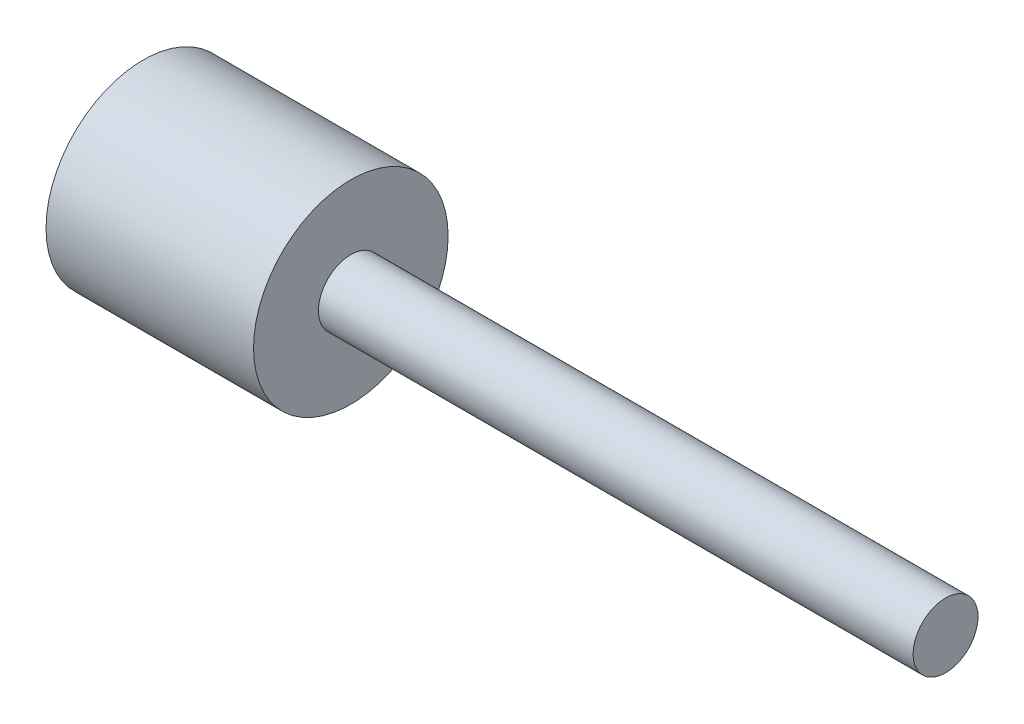
ISO-10303-21;
HEADER;
FILE_DESCRIPTION(('STEP AP214'),'2;1');
FILE_NAME('part.step','',(''),(''),'','','');
FILE_SCHEMA(('AUTOMOTIVE_DESIGN { 1 0 10303 214 1 1 1 1 }'));
ENDSEC;
DATA;
#1=APPLICATION_CONTEXT('core data for automotive mechanical design processes');
#2=APPLICATION_PROTOCOL_DEFINITION('international standard','automotive_design',2000,#1);
#3=PRODUCT_CONTEXT('',#1,'mechanical');
#4=PRODUCT('Part','Part','',(#3));
#5=PRODUCT_RELATED_PRODUCT_CATEGORY('part','',(#4));
#6=PRODUCT_DEFINITION_FORMATION('','',#4);
#7=PRODUCT_DEFINITION_CONTEXT('part definition',#1,'design');
#8=PRODUCT_DEFINITION('design','',#6,#7);
#9=PRODUCT_DEFINITION_SHAPE('','',#8);
#10=(LENGTH_UNIT() NAMED_UNIT(*) SI_UNIT(.MILLI.,.METRE.));
#11=(NAMED_UNIT(*) PLANE_ANGLE_UNIT() SI_UNIT($,.RADIAN.));
#12=(NAMED_UNIT(*) SI_UNIT($,.STERADIAN.) SOLID_ANGLE_UNIT());
#13=UNCERTAINTY_MEASURE_WITH_UNIT(LENGTH_MEASURE(1.E-05),#10,'distance_accuracy_value','');
#14=(GEOMETRIC_REPRESENTATION_CONTEXT(3) GLOBAL_UNCERTAINTY_ASSIGNED_CONTEXT((#13)) GLOBAL_UNIT_ASSIGNED_CONTEXT((#10,
#11,#12)) REPRESENTATION_CONTEXT('',''));
#15=CARTESIAN_POINT('',(0.,0.,0.));
#16=DIRECTION('',(0.,0.,1.));
#17=DIRECTION('',(1.,0.,0.));
#18=AXIS2_PLACEMENT_3D('',#15,#16,#17);
#19=CARTESIAN_POINT('',(16.,0.,0.));
#20=DIRECTION('',(-1.,0.,0.));
#21=DIRECTION('',(0.,0.,1.));
#22=AXIS2_PLACEMENT_3D('',#19,#20,#21);
#23=CYLINDRICAL_SURFACE('',#22,7.5);
#24=CARTESIAN_POINT('',(5.,-7.34846922834953,1.5));
#25=CARTESIAN_POINT('',(4.91665343676424,-7.34847088538349,1.49999691881235));
#26=CARTESIAN_POINT('',(4.83326806500025,-7.34990262402618,1.49302975757707));
#27=CARTESIAN_POINT('',(4.66885624228504,-7.35546646957746,1.46536842537441));
#28=CARTESIAN_POINT('',(4.58783173304596,-7.35960073717297,1.44466327060578));
#29=CARTESIAN_POINT('',(4.43054404496875,-7.37008310582665,1.39019367392958));
#30=CARTESIAN_POINT('',(4.35427621770114,-7.37642900431582,1.35644222122892));
#31=CARTESIAN_POINT('',(4.20848773295455,-7.39061699221019,1.27687366150577));
#32=CARTESIAN_POINT('',(4.13896669919314,-7.398458998102,1.23105722790173));
#33=CARTESIAN_POINT('',(4.00765849421921,-7.4148794954137,1.12796861348015));
#34=CARTESIAN_POINT('',(3.94598061817404,-7.42346606755867,1.07055848386998));
#35=CARTESIAN_POINT('',(3.83306369963153,-7.440337084539,0.946210183531966));
#36=CARTESIAN_POINT('',(3.78182538887421,-7.44862150816248,0.879271345466977));
#37=CARTESIAN_POINT('',(3.69081797355731,-7.46404194626342,0.737042033886384));
#38=CARTESIAN_POINT('',(3.65115272927504,-7.47116732162326,0.661683851508316));
#39=CARTESIAN_POINT('',(3.5850875944278,-7.48337605325447,0.505206225580907));
#40=CARTESIAN_POINT('',(3.55868646214851,-7.48845960066179,0.42408732213083));
#41=CARTESIAN_POINT('',(3.52023920957056,-7.49595481032628,0.259525159917742));
#42=CARTESIAN_POINT('',(3.50800853364349,-7.4984007943219,0.176126608822221));
#43=CARTESIAN_POINT('',(3.49767357224253,-7.50046381775405,0.00842785265630496));
#44=CARTESIAN_POINT('',(3.49956792553127,-7.50008112979138,-0.0758722647477643));
#45=CARTESIAN_POINT('',(3.51728927032333,-7.49655652302773,-0.241713001115383));
#46=CARTESIAN_POINT('',(3.53291746575177,-7.49345397548757,-0.323275821447705));
#47=CARTESIAN_POINT('',(3.57734754868834,-7.48488265739113,-0.482597439870451));
#48=CARTESIAN_POINT('',(3.60614996328781,-7.47941379216059,-0.560356085620693));
#49=CARTESIAN_POINT('',(3.6762950602209,-7.46665944029938,-0.71042919480133));
#50=CARTESIAN_POINT('',(3.71771562665733,-7.45936272262835,-0.78270626120085));
#51=CARTESIAN_POINT('',(3.8118636158549,-7.44375704210678,-0.919357568789634));
#52=CARTESIAN_POINT('',(3.86459233965578,-7.43544796282833,-0.983730899287501));
#53=CARTESIAN_POINT('',(3.98095043316271,-7.41856446546689,-1.10392714658019));
#54=CARTESIAN_POINT('',(4.04475378009439,-7.40998794686274,-1.15958147486045));
#55=CARTESIAN_POINT('',(4.18087466367613,-7.39367357398141,-1.25942773976521));
#56=CARTESIAN_POINT('',(4.25319236132479,-7.38593573556822,-1.30361945959163));
#57=CARTESIAN_POINT('',(4.40453124773271,-7.37217071209385,-1.37934422220282));
#58=CARTESIAN_POINT('',(4.48356645145949,-7.36614722345324,-1.41084997166656));
#59=CARTESIAN_POINT('',(4.64595698558599,-7.35654714481909,-1.46008551244137));
#60=CARTESIAN_POINT('',(4.72931175142863,-7.35297023592642,-1.47781709918496));
#61=CARTESIAN_POINT('',(4.89644728699857,-7.34873218901742,-1.49874900905408));
#62=CARTESIAN_POINT('',(4.98019636146551,-7.34802220585731,-1.50219278834687));
#63=CARTESIAN_POINT('',(5.14707233479953,-7.34946728533281,-1.49510644246611));
#64=CARTESIAN_POINT('',(5.2301992686783,-7.35162218550582,-1.48457710968366));
#65=CARTESIAN_POINT('',(5.39265296043835,-7.35850848742372,-1.45005331211123));
#66=CARTESIAN_POINT('',(5.47200851455364,-7.36321498521745,-1.42618893125895));
#67=CARTESIAN_POINT('',(5.62559491854311,-7.37465234027497,-1.36581155296278));
#68=CARTESIAN_POINT('',(5.69982534565358,-7.38138336429404,-1.32929751355976));
#69=CARTESIAN_POINT('',(5.84211966492524,-7.39622108943059,-1.2441062133234));
#70=CARTESIAN_POINT('',(5.91009056945124,-7.40434457797355,-1.19527661697413));
#71=CARTESIAN_POINT('',(6.03696246800137,-7.42100585739955,-1.08704335831907));
#72=CARTESIAN_POINT('',(6.09586252737388,-7.42954369085727,-1.02763860771681));
#73=CARTESIAN_POINT('',(6.20384383877836,-7.44623018803823,-0.898848410246836));
#74=CARTESIAN_POINT('',(6.25276048197499,-7.45437086563026,-0.829323748394444));
#75=CARTESIAN_POINT('',(6.33821882224937,-7.4692069144293,-0.682901844952133));
#76=CARTESIAN_POINT('',(6.37476103901717,-7.47590234632816,-0.60600491315026));
#77=CARTESIAN_POINT('',(6.43419330761995,-7.487059410916,-0.447454021236019));
#78=CARTESIAN_POINT('',(6.45716077733938,-7.49153368713906,-0.365830010217117));
#79=CARTESIAN_POINT('',(6.48903687149577,-7.4977985390649,-0.199784182019869));
#80=CARTESIAN_POINT('',(6.49794718921352,-7.49958943799765,-0.115362703066822));
#81=CARTESIAN_POINT('',(6.50139047144433,-7.50027810681181,0.0523093408554342));
#82=CARTESIAN_POINT('',(6.49617092068432,-7.49922567824026,0.135554718212252));
#83=CARTESIAN_POINT('',(6.47204907417828,-7.49445065340477,0.299956546973461));
#84=CARTESIAN_POINT('',(6.45314695047789,-7.49072809071528,0.381113024630536));
#85=CARTESIAN_POINT('',(6.40230651186253,-7.481032475475,0.538879124617643));
#86=CARTESIAN_POINT('',(6.37039793280322,-7.47506455871866,0.61549866486042));
#87=CARTESIAN_POINT('',(6.29448163800365,-7.46152083185077,0.762331830278928));
#88=CARTESIAN_POINT('',(6.25047296614443,-7.45394489468828,0.832544948651117));
#89=CARTESIAN_POINT('',(6.15077091940688,-7.43786398736791,0.965795835159535));
#90=CARTESIAN_POINT('',(6.09490049541984,-7.4293460013317,1.02869957417475));
#91=CARTESIAN_POINT('',(5.97342463985635,-7.41241834355477,1.14432392663527));
#92=CARTESIAN_POINT('',(5.90781690579693,-7.40400869794476,1.19704212480408));
#93=CARTESIAN_POINT('',(5.7678810249497,-7.3881501412478,1.29133832918279));
#94=CARTESIAN_POINT('',(5.69346655825931,-7.38071255446371,1.33279022195961));
#95=CARTESIAN_POINT('',(5.5386008400506,-7.36777855777287,1.40253607393175));
#96=CARTESIAN_POINT('',(5.45815514195366,-7.36228038807749,1.43084196896908));
#97=CARTESIAN_POINT('',(5.31460631684475,-7.3549452169166,1.4680037097813));
#98=CARTESIAN_POINT('',(5.25232187073151,-7.35253177367824,1.47998084778412));
#99=CARTESIAN_POINT('',(5.12669906817085,-7.34929317692711,1.49598002694097));
#100=CARTESIAN_POINT('',(5.06336074813256,-7.34846796865859,1.50000234234439));
#101=CARTESIAN_POINT('',(5.,-7.34846922834953,1.5));
#102=B_SPLINE_CURVE_WITH_KNOTS('',3,(#24,#25,#26,#27,#28,#29,#30,#31,#32,#33,#34,#35,#36,#37,
#38,#39,#40,#41,#42,#43,#44,#45,#46,#47,#48,#49,#50,#51,#52,#53,#54,#55,#56,#57,#58,#59,#60,#61,
#62,#63,#64,#65,#66,#67,#68,#69,#70,#71,#72,#73,#74,#75,#76,#77,#78,#79,#80,#81,#82,#83,#84,#85,
#86,#87,#88,#89,#90,#91,#92,#93,#94,#95,#96,#97,#98,#99,#100,#101),.UNSPECIFIED.,.T.,.F.,(4,2,2,
2,2,2,2,2,2,2,2,2,2,2,2,2,2,2,2,2,2,2,2,2,2,2,2,2,2,2,2,2,2,2,2,2,2,2,4),(0.,0.249807695804142,
0.499815358926445,0.749574746910878,0.999320197289795,1.25223378822655,1.50516510053133,
1.76030100656175,2.0154130236984,2.26716373324621,2.51889018174372,2.76703184450306,
3.01518343610625,3.26489886333455,3.51464303655099,3.76874020143725,4.0228421718408,
4.27748794759165,4.53210052524037,4.7823563670689,5.03259801792632,5.28044012674978,
5.52830265531597,5.77939589661781,6.03051499305313,6.28548902600176,6.54045234945157,
6.79394720367975,7.04741152037441,7.29646526122028,7.54551587050135,7.79400025613177,
8.04250428202026,8.29501728038395,8.54759008334671,8.80288347868561,9.05794462633398,
9.24785705455343,9.43776293526322),.UNSPECIFIED.);
#103=CARTESIAN_POINT('',(5.,-7.34846922834953,1.5));
#104=VERTEX_POINT('',#103);
#105=EDGE_CURVE('E75',#104,#104,#102,.T.);
#106=ORIENTED_EDGE('',*,*,#105,.F.);
#107=EDGE_LOOP('',(#106));
#108=FACE_BOUND('',#107,.T.);
#109=CARTESIAN_POINT('',(16.,0.,0.));
#110=DIRECTION('',(1.,0.,0.));
#111=DIRECTION('',(0.,0.,-1.));
#112=AXIS2_PLACEMENT_3D('',#109,#110,#111);
#113=CIRCLE('',#112,7.5);
#114=CARTESIAN_POINT('',(16.,0.,-7.5));
#115=VERTEX_POINT('',#114);
#116=EDGE_CURVE('E41',#115,#115,#113,.T.);
#117=ORIENTED_EDGE('',*,*,#116,.F.);
#118=EDGE_LOOP('',(#117));
#119=FACE_BOUND('',#118,.T.);
#120=CARTESIAN_POINT('',(0.,0.,0.));
#121=DIRECTION('',(1.,0.,0.));
#122=DIRECTION('',(0.,0.,-1.));
#123=AXIS2_PLACEMENT_3D('',#120,#121,#122);
#124=CIRCLE('',#123,7.5);
#125=CARTESIAN_POINT('',(0.,0.,-7.5));
#126=VERTEX_POINT('',#125);
#127=EDGE_CURVE('E36',#126,#126,#124,.T.);
#128=ORIENTED_EDGE('',*,*,#127,.T.);
#129=EDGE_LOOP('',(#128));
#130=FACE_BOUND('',#129,.T.);
#131=ADVANCED_FACE('F33',(#108,#119,#130),#23,.T.);
#132=CARTESIAN_POINT('',(16.,0.,0.));
#133=DIRECTION('',(1.,0.,0.));
#134=DIRECTION('',(0.,0.,-1.));
#135=AXIS2_PLACEMENT_3D('',#132,#133,#134);
#136=PLANE('',#135);
#137=CARTESIAN_POINT('',(16.,0.,0.));
#138=DIRECTION('',(1.,0.,0.));
#139=DIRECTION('',(0.,0.,-1.));
#140=AXIS2_PLACEMENT_3D('',#137,#138,#139);
#141=CIRCLE('',#140,2.5);
#142=CARTESIAN_POINT('',(16.,0.,-2.5));
#143=VERTEX_POINT('',#142);
#144=EDGE_CURVE('E11',#143,#143,#141,.T.);
#145=ORIENTED_EDGE('',*,*,#144,.F.);
#146=EDGE_LOOP('',(#145));
#147=FACE_BOUND('',#146,.T.);
#148=ORIENTED_EDGE('',*,*,#116,.T.);
#149=EDGE_LOOP('',(#148));
#150=FACE_BOUND('',#149,.T.);
#151=ADVANCED_FACE('F94',(#147,#150),#136,.T.);
#152=CARTESIAN_POINT('',(0.,0.,0.));
#153=DIRECTION('',(1.,0.,0.));
#154=DIRECTION('',(0.,0.,-1.));
#155=AXIS2_PLACEMENT_3D('',#152,#153,#154);
#156=PLANE('',#155);
#157=DIRECTION('',(0.,0.,1.));
#158=VECTOR('',#157,1.);
#159=CARTESIAN_POINT('',(0.,-2.1,-2.28035085019828));
#160=LINE('',#159,#158);
#161=CARTESIAN_POINT('',(0.,-2.1,-2.28035085019828));
#162=VERTEX_POINT('',#161);
#163=CARTESIAN_POINT('',(0.,-2.1,2.28035085019828));
#164=VERTEX_POINT('',#163);
#165=EDGE_CURVE('E69',#162,#164,#160,.T.);
#166=ORIENTED_EDGE('',*,*,#165,.F.);
#167=CARTESIAN_POINT('',(0.,0.,0.));
#168=DIRECTION('',(-1.,0.,0.));
#169=DIRECTION('',(0.,0.,1.));
#170=AXIS2_PLACEMENT_3D('',#167,#168,#169);
#171=CIRCLE('',#170,3.1);
#172=EDGE_CURVE('E49',#164,#162,#171,.T.);
#173=ORIENTED_EDGE('',*,*,#172,.F.);
#174=EDGE_LOOP('',(#166,#173));
#175=FACE_BOUND('',#174,.T.);
#176=ORIENTED_EDGE('',*,*,#127,.F.);
#177=EDGE_LOOP('',(#176));
#178=FACE_BOUND('',#177,.T.);
#179=ADVANCED_FACE('F73',(#175,#178),#156,.F.);
#180=CARTESIAN_POINT('',(61.85,0.,0.));
#181=DIRECTION('',(-1.,0.,0.));
#182=DIRECTION('',(0.,0.,1.));
#183=AXIS2_PLACEMENT_3D('',#180,#181,#182);
#184=CYLINDRICAL_SURFACE('',#183,2.5);
#185=CARTESIAN_POINT('',(61.85,0.,0.));
#186=DIRECTION('',(1.,0.,0.));
#187=DIRECTION('',(0.,0.,-1.));
#188=AXIS2_PLACEMENT_3D('',#185,#186,#187);
#189=CIRCLE('',#188,2.5);
#190=CARTESIAN_POINT('',(61.85,0.,-2.5));
#191=VERTEX_POINT('',#190);
#192=EDGE_CURVE('E65',#191,#191,#189,.T.);
#193=ORIENTED_EDGE('',*,*,#192,.F.);
#194=EDGE_LOOP('',(#193));
#195=FACE_BOUND('',#194,.T.);
#196=ORIENTED_EDGE('',*,*,#144,.T.);
#197=EDGE_LOOP('',(#196));
#198=FACE_BOUND('',#197,.T.);
#199=ADVANCED_FACE('F93',(#195,#198),#184,.T.);
#200=CARTESIAN_POINT('',(61.85,0.,0.));
#201=DIRECTION('',(1.,0.,0.));
#202=DIRECTION('',(0.,0.,-1.));
#203=AXIS2_PLACEMENT_3D('',#200,#201,#202);
#204=PLANE('',#203);
#205=ORIENTED_EDGE('',*,*,#192,.T.);
#206=EDGE_LOOP('',(#205));
#207=FACE_BOUND('',#206,.T.);
#208=ADVANCED_FACE('F99',(#207),#204,.T.);
#209=CARTESIAN_POINT('',(12.,0.,0.));
#210=DIRECTION('',(-1.,0.,0.));
#211=DIRECTION('',(0.,0.,1.));
#212=AXIS2_PLACEMENT_3D('',#209,#210,#211);
#213=CYLINDRICAL_SURFACE('',#212,3.1);
#214=ORIENTED_EDGE('',*,*,#172,.T.);
#215=DIRECTION('',(-1.,0.,0.));
#216=VECTOR('',#215,1.);
#217=CARTESIAN_POINT('',(12.,-2.1,-2.28035085019828));
#218=LINE('',#217,#216);
#219=CARTESIAN_POINT('',(12.,-2.1,-2.28035085019828));
#220=VERTEX_POINT('',#219);
#221=EDGE_CURVE('E66',#220,#162,#218,.T.);
#222=ORIENTED_EDGE('',*,*,#221,.F.);
#223=CARTESIAN_POINT('',(12.,0.,0.));
#224=DIRECTION('',(-1.,0.,0.));
#225=DIRECTION('',(0.,0.,1.));
#226=AXIS2_PLACEMENT_3D('',#223,#224,#225);
#227=CIRCLE('',#226,3.1);
#228=CARTESIAN_POINT('',(12.,-2.1,2.28035085019828));
#229=VERTEX_POINT('',#228);
#230=EDGE_CURVE('E63',#229,#220,#227,.T.);
#231=ORIENTED_EDGE('',*,*,#230,.F.);
#232=DIRECTION('',(-1.,0.,0.));
#233=VECTOR('',#232,1.);
#234=CARTESIAN_POINT('',(12.,-2.1,2.28035085019828));
#235=LINE('',#234,#233);
#236=EDGE_CURVE('E57',#229,#164,#235,.T.);
#237=ORIENTED_EDGE('',*,*,#236,.T.);
#238=EDGE_LOOP('',(#214,#222,#231,#237));
#239=FACE_BOUND('',#238,.T.);
#240=ADVANCED_FACE('F61',(#239),#213,.F.);
#241=CARTESIAN_POINT('',(12.,-2.1,-2.28035085019828));
#242=DIRECTION('',(0.,-1.,0.));
#243=DIRECTION('',(0.,0.,-1.));
#244=AXIS2_PLACEMENT_3D('',#241,#242,#243);
#245=PLANE('',#244);
#246=CARTESIAN_POINT('',(5.,-2.1,0.));
#247=DIRECTION('',(0.,1.,0.));
#248=DIRECTION('',(0.,0.,1.));
#249=AXIS2_PLACEMENT_3D('',#246,#247,#248);
#250=CIRCLE('',#249,1.5);
#251=CARTESIAN_POINT('',(5.,-2.1,1.5));
#252=VERTEX_POINT('',#251);
#253=EDGE_CURVE('E78',#252,#252,#250,.T.);
#254=ORIENTED_EDGE('',*,*,#253,.F.);
#255=EDGE_LOOP('',(#254));
#256=FACE_BOUND('',#255,.T.);
#257=ORIENTED_EDGE('',*,*,#165,.T.);
#258=ORIENTED_EDGE('',*,*,#236,.F.);
#259=DIRECTION('',(0.,0.,1.));
#260=VECTOR('',#259,1.);
#261=CARTESIAN_POINT('',(12.,-2.1,-2.28035085019828));
#262=LINE('',#261,#260);
#263=EDGE_CURVE('E81',#220,#229,#262,.T.);
#264=ORIENTED_EDGE('',*,*,#263,.F.);
#265=ORIENTED_EDGE('',*,*,#221,.T.);
#266=EDGE_LOOP('',(#257,#258,#264,#265));
#267=FACE_BOUND('',#266,.T.);
#268=ADVANCED_FACE('F70',(#256,#267),#245,.F.);
#269=CARTESIAN_POINT('',(12.,0.,0.));
#270=DIRECTION('',(-1.,0.,0.));
#271=DIRECTION('',(0.,0.,1.));
#272=AXIS2_PLACEMENT_3D('',#269,#270,#271);
#273=PLANE('',#272);
#274=ORIENTED_EDGE('',*,*,#230,.T.);
#275=ORIENTED_EDGE('',*,*,#263,.T.);
#276=EDGE_LOOP('',(#274,#275));
#277=FACE_BOUND('',#276,.T.);
#278=ADVANCED_FACE('F113',(#277),#273,.T.);
#279=CARTESIAN_POINT('',(5.,-7.501,0.));
#280=DIRECTION('',(0.,1.,0.));
#281=DIRECTION('',(0.,0.,1.));
#282=AXIS2_PLACEMENT_3D('',#279,#280,#281);
#283=CYLINDRICAL_SURFACE('',#282,1.5);
#284=ORIENTED_EDGE('',*,*,#253,.T.);
#285=EDGE_LOOP('',(#284));
#286=FACE_BOUND('',#285,.T.);
#287=ORIENTED_EDGE('',*,*,#105,.T.);
#288=EDGE_LOOP('',(#287));
#289=FACE_BOUND('',#288,.T.);
#290=ADVANCED_FACE('F111',(#286,#289),#283,.F.);
#291=CLOSED_SHELL('',(#131,#151,#179,#199,#208,#240,#268,#278,#290));
#292=MANIFOLD_SOLID_BREP('B2',#291);
#293=ADVANCED_BREP_SHAPE_REPRESENTATION('',(#18,#292),#14);
#294=SHAPE_DEFINITION_REPRESENTATION(#9,#293);
ENDSEC;
END-ISO-10303-21;
